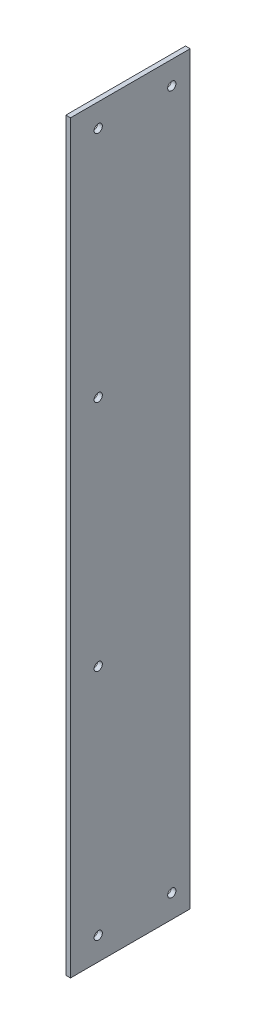
ISO-10303-21;
HEADER;
FILE_DESCRIPTION(('STEP AP214'),'2;1');
FILE_NAME('part.step','',(''),(''),'','','');
FILE_SCHEMA(('AUTOMOTIVE_DESIGN { 1 0 10303 214 1 1 1 1 }'));
ENDSEC;
DATA;
#1=APPLICATION_CONTEXT('core data for automotive mechanical design processes');
#2=APPLICATION_PROTOCOL_DEFINITION('international standard','automotive_design',2000,#1);
#3=PRODUCT_CONTEXT('',#1,'mechanical');
#4=PRODUCT('Part','Part','',(#3));
#5=PRODUCT_RELATED_PRODUCT_CATEGORY('part','',(#4));
#6=PRODUCT_DEFINITION_FORMATION('','',#4);
#7=PRODUCT_DEFINITION_CONTEXT('part definition',#1,'design');
#8=PRODUCT_DEFINITION('design','',#6,#7);
#9=PRODUCT_DEFINITION_SHAPE('','',#8);
#10=(LENGTH_UNIT() NAMED_UNIT(*) SI_UNIT(.MILLI.,.METRE.));
#11=(NAMED_UNIT(*) PLANE_ANGLE_UNIT() SI_UNIT($,.RADIAN.));
#12=(NAMED_UNIT(*) SI_UNIT($,.STERADIAN.) SOLID_ANGLE_UNIT());
#13=UNCERTAINTY_MEASURE_WITH_UNIT(LENGTH_MEASURE(1.E-05),#10,'distance_accuracy_value','');
#14=(GEOMETRIC_REPRESENTATION_CONTEXT(3) GLOBAL_UNCERTAINTY_ASSIGNED_CONTEXT((#13)) GLOBAL_UNIT_ASSIGNED_CONTEXT((#10,
#11,#12)) REPRESENTATION_CONTEXT('',''));
#15=CARTESIAN_POINT('',(0.,0.,0.));
#16=DIRECTION('',(0.,0.,1.));
#17=DIRECTION('',(1.,0.,0.));
#18=AXIS2_PLACEMENT_3D('',#15,#16,#17);
#19=CARTESIAN_POINT('',(3.175,0.,-37.5));
#20=DIRECTION('',(0.,0.,-1.));
#21=DIRECTION('',(0.,1.,0.));
#22=AXIS2_PLACEMENT_3D('',#19,#20,#21);
#23=PLANE('',#22);
#24=DIRECTION('',(0.,-1.,0.));
#25=VECTOR('',#24,1.);
#26=CARTESIAN_POINT('',(0.,0.,-37.5));
#27=LINE('',#26,#25);
#28=CARTESIAN_POINT('',(0.,253.175,-37.5));
#29=VERTEX_POINT('',#28);
#30=CARTESIAN_POINT('',(0.,-253.175,-37.5));
#31=VERTEX_POINT('',#30);
#32=EDGE_CURVE('E51',#29,#31,#27,.T.);
#33=ORIENTED_EDGE('',*,*,#32,.F.);
#34=DIRECTION('',(1.,0.,0.));
#35=VECTOR('',#34,1.);
#36=CARTESIAN_POINT('',(0.,253.175,-37.5));
#37=LINE('',#36,#35);
#38=CARTESIAN_POINT('',(3.175,253.175,-37.5));
#39=VERTEX_POINT('',#38);
#40=EDGE_CURVE('E99',#29,#39,#37,.T.);
#41=ORIENTED_EDGE('',*,*,#40,.T.);
#42=DIRECTION('',(0.,-1.,0.));
#43=VECTOR('',#42,1.);
#44=CARTESIAN_POINT('',(3.175,0.,-37.5));
#45=LINE('',#44,#43);
#46=CARTESIAN_POINT('',(3.175,-253.175,-37.5));
#47=VERTEX_POINT('',#46);
#48=EDGE_CURVE('E11',#39,#47,#45,.T.);
#49=ORIENTED_EDGE('',*,*,#48,.T.);
#50=DIRECTION('',(1.,0.,0.));
#51=VECTOR('',#50,1.);
#52=CARTESIAN_POINT('',(0.,-253.175,-37.5));
#53=LINE('',#52,#51);
#54=EDGE_CURVE('E101',#31,#47,#53,.T.);
#55=ORIENTED_EDGE('',*,*,#54,.F.);
#56=EDGE_LOOP('',(#33,#41,#49,#55));
#57=FACE_BOUND('',#56,.T.);
#58=ADVANCED_FACE('F47',(#57),#23,.T.);
#59=CARTESIAN_POINT('',(3.175,-237.5,25.));
#60=DIRECTION('',(-1.,0.,0.));
#61=DIRECTION('',(0.,0.,1.));
#62=AXIS2_PLACEMENT_3D('',#59,#60,#61);
#63=CYLINDRICAL_SURFACE('',#62,2.80000000000001);
#64=CARTESIAN_POINT('',(3.175,-237.5,25.));
#65=DIRECTION('',(1.,0.,0.));
#66=DIRECTION('',(0.,0.,-1.));
#67=AXIS2_PLACEMENT_3D('',#64,#65,#66);
#68=CIRCLE('',#67,2.80000000000001);
#69=CARTESIAN_POINT('',(3.175,-237.5,22.2));
#70=VERTEX_POINT('',#69);
#71=EDGE_CURVE('E58',#70,#70,#68,.T.);
#72=ORIENTED_EDGE('',*,*,#71,.T.);
#73=EDGE_LOOP('',(#72));
#74=FACE_BOUND('',#73,.T.);
#75=CARTESIAN_POINT('',(0.,-237.5,25.));
#76=DIRECTION('',(1.,0.,0.));
#77=DIRECTION('',(0.,0.,-1.));
#78=AXIS2_PLACEMENT_3D('',#75,#76,#77);
#79=CIRCLE('',#78,2.80000000000001);
#80=CARTESIAN_POINT('',(0.,-237.5,22.2));
#81=VERTEX_POINT('',#80);
#82=EDGE_CURVE('E104',#81,#81,#79,.T.);
#83=ORIENTED_EDGE('',*,*,#82,.F.);
#84=EDGE_LOOP('',(#83));
#85=FACE_BOUND('',#84,.T.);
#86=ADVANCED_FACE('F180',(#74,#85),#63,.F.);
#87=CARTESIAN_POINT('',(3.175,-79.16666667,25.));
#88=DIRECTION('',(-1.,0.,0.));
#89=DIRECTION('',(0.,0.,1.));
#90=AXIS2_PLACEMENT_3D('',#87,#88,#89);
#91=CYLINDRICAL_SURFACE('',#90,2.80000000000001);
#92=CARTESIAN_POINT('',(3.175,-79.16666667,25.));
#93=DIRECTION('',(1.,0.,0.));
#94=DIRECTION('',(0.,0.,-1.));
#95=AXIS2_PLACEMENT_3D('',#92,#93,#94);
#96=CIRCLE('',#95,2.80000000000001);
#97=CARTESIAN_POINT('',(3.175,-79.16666667,22.2));
#98=VERTEX_POINT('',#97);
#99=EDGE_CURVE('E150',#98,#98,#96,.T.);
#100=ORIENTED_EDGE('',*,*,#99,.T.);
#101=EDGE_LOOP('',(#100));
#102=FACE_BOUND('',#101,.T.);
#103=CARTESIAN_POINT('',(0.,-79.16666667,25.));
#104=DIRECTION('',(1.,0.,0.));
#105=DIRECTION('',(0.,0.,-1.));
#106=AXIS2_PLACEMENT_3D('',#103,#104,#105);
#107=CIRCLE('',#106,2.80000000000001);
#108=CARTESIAN_POINT('',(0.,-79.16666667,22.2));
#109=VERTEX_POINT('',#108);
#110=EDGE_CURVE('E172',#109,#109,#107,.T.);
#111=ORIENTED_EDGE('',*,*,#110,.F.);
#112=EDGE_LOOP('',(#111));
#113=FACE_BOUND('',#112,.T.);
#114=ADVANCED_FACE('F182',(#102,#113),#91,.F.);
#115=CARTESIAN_POINT('',(3.175,79.16666666,25.));
#116=DIRECTION('',(-1.,0.,0.));
#117=DIRECTION('',(0.,0.,1.));
#118=AXIS2_PLACEMENT_3D('',#115,#116,#117);
#119=CYLINDRICAL_SURFACE('',#118,2.80000000000001);
#120=CARTESIAN_POINT('',(3.175,79.16666666,25.));
#121=DIRECTION('',(1.,0.,0.));
#122=DIRECTION('',(0.,0.,-1.));
#123=AXIS2_PLACEMENT_3D('',#120,#121,#122);
#124=CIRCLE('',#123,2.80000000000001);
#125=CARTESIAN_POINT('',(3.175,79.16666666,22.2));
#126=VERTEX_POINT('',#125);
#127=EDGE_CURVE('E146',#126,#126,#124,.T.);
#128=ORIENTED_EDGE('',*,*,#127,.T.);
#129=EDGE_LOOP('',(#128));
#130=FACE_BOUND('',#129,.T.);
#131=CARTESIAN_POINT('',(0.,79.16666666,25.));
#132=DIRECTION('',(1.,0.,0.));
#133=DIRECTION('',(0.,0.,-1.));
#134=AXIS2_PLACEMENT_3D('',#131,#132,#133);
#135=CIRCLE('',#134,2.80000000000001);
#136=CARTESIAN_POINT('',(0.,79.16666666,22.2));
#137=VERTEX_POINT('',#136);
#138=EDGE_CURVE('E168',#137,#137,#135,.T.);
#139=ORIENTED_EDGE('',*,*,#138,.F.);
#140=EDGE_LOOP('',(#139));
#141=FACE_BOUND('',#140,.T.);
#142=ADVANCED_FACE('F188',(#130,#141),#119,.F.);
#143=CARTESIAN_POINT('',(3.175,237.49999999,25.));
#144=DIRECTION('',(-1.,0.,0.));
#145=DIRECTION('',(0.,0.,1.));
#146=AXIS2_PLACEMENT_3D('',#143,#144,#145);
#147=CYLINDRICAL_SURFACE('',#146,2.80000000000001);
#148=CARTESIAN_POINT('',(3.175,237.49999999,25.));
#149=DIRECTION('',(1.,0.,0.));
#150=DIRECTION('',(0.,0.,-1.));
#151=AXIS2_PLACEMENT_3D('',#148,#149,#150);
#152=CIRCLE('',#151,2.80000000000001);
#153=CARTESIAN_POINT('',(3.175,237.49999999,22.2));
#154=VERTEX_POINT('',#153);
#155=EDGE_CURVE('E142',#154,#154,#152,.T.);
#156=ORIENTED_EDGE('',*,*,#155,.T.);
#157=EDGE_LOOP('',(#156));
#158=FACE_BOUND('',#157,.T.);
#159=CARTESIAN_POINT('',(0.,237.49999999,25.));
#160=DIRECTION('',(1.,0.,0.));
#161=DIRECTION('',(0.,0.,-1.));
#162=AXIS2_PLACEMENT_3D('',#159,#160,#161);
#163=CIRCLE('',#162,2.80000000000001);
#164=CARTESIAN_POINT('',(0.,237.49999999,22.2));
#165=VERTEX_POINT('',#164);
#166=EDGE_CURVE('E164',#165,#165,#163,.T.);
#167=ORIENTED_EDGE('',*,*,#166,.F.);
#168=EDGE_LOOP('',(#167));
#169=FACE_BOUND('',#168,.T.);
#170=ADVANCED_FACE('F197',(#158,#169),#147,.F.);
#171=CARTESIAN_POINT('',(3.175,237.49999999,-25.));
#172=DIRECTION('',(-1.,0.,0.));
#173=DIRECTION('',(0.,0.,1.));
#174=AXIS2_PLACEMENT_3D('',#171,#172,#173);
#175=CYLINDRICAL_SURFACE('',#174,2.80000000000001);
#176=CARTESIAN_POINT('',(3.175,237.49999999,-25.));
#177=DIRECTION('',(1.,0.,0.));
#178=DIRECTION('',(0.,0.,-1.));
#179=AXIS2_PLACEMENT_3D('',#176,#177,#178);
#180=CIRCLE('',#179,2.80000000000001);
#181=CARTESIAN_POINT('',(3.175,237.49999999,-27.8));
#182=VERTEX_POINT('',#181);
#183=EDGE_CURVE('E138',#182,#182,#180,.T.);
#184=ORIENTED_EDGE('',*,*,#183,.T.);
#185=EDGE_LOOP('',(#184));
#186=FACE_BOUND('',#185,.T.);
#187=CARTESIAN_POINT('',(0.,237.49999999,-25.));
#188=DIRECTION('',(1.,0.,0.));
#189=DIRECTION('',(0.,0.,-1.));
#190=AXIS2_PLACEMENT_3D('',#187,#188,#189);
#191=CIRCLE('',#190,2.80000000000001);
#192=CARTESIAN_POINT('',(0.,237.49999999,-27.8));
#193=VERTEX_POINT('',#192);
#194=EDGE_CURVE('E160',#193,#193,#191,.T.);
#195=ORIENTED_EDGE('',*,*,#194,.F.);
#196=EDGE_LOOP('',(#195));
#197=FACE_BOUND('',#196,.T.);
#198=ADVANCED_FACE('F200',(#186,#197),#175,.F.);
#199=CARTESIAN_POINT('',(3.175,-237.5,-25.));
#200=DIRECTION('',(-1.,0.,0.));
#201=DIRECTION('',(0.,0.,1.));
#202=AXIS2_PLACEMENT_3D('',#199,#200,#201);
#203=CYLINDRICAL_SURFACE('',#202,2.80000000000001);
#204=CARTESIAN_POINT('',(3.175,-237.5,-25.));
#205=DIRECTION('',(1.,0.,0.));
#206=DIRECTION('',(0.,0.,-1.));
#207=AXIS2_PLACEMENT_3D('',#204,#205,#206);
#208=CIRCLE('',#207,2.80000000000001);
#209=CARTESIAN_POINT('',(3.175,-237.5,-27.8));
#210=VERTEX_POINT('',#209);
#211=EDGE_CURVE('E103',#210,#210,#208,.T.);
#212=ORIENTED_EDGE('',*,*,#211,.T.);
#213=EDGE_LOOP('',(#212));
#214=FACE_BOUND('',#213,.T.);
#215=CARTESIAN_POINT('',(0.,-237.5,-25.));
#216=DIRECTION('',(1.,0.,0.));
#217=DIRECTION('',(0.,0.,-1.));
#218=AXIS2_PLACEMENT_3D('',#215,#216,#217);
#219=CIRCLE('',#218,2.80000000000001);
#220=CARTESIAN_POINT('',(0.,-237.5,-27.8));
#221=VERTEX_POINT('',#220);
#222=EDGE_CURVE('E130',#221,#221,#219,.T.);
#223=ORIENTED_EDGE('',*,*,#222,.F.);
#224=EDGE_LOOP('',(#223));
#225=FACE_BOUND('',#224,.T.);
#226=ADVANCED_FACE('F49',(#214,#225),#203,.F.);
#227=CARTESIAN_POINT('',(3.175,0.,0.));
#228=DIRECTION('',(1.,0.,0.));
#229=DIRECTION('',(0.,0.,-1.));
#230=AXIS2_PLACEMENT_3D('',#227,#228,#229);
#231=PLANE('',#230);
#232=ORIENTED_EDGE('',*,*,#211,.F.);
#233=EDGE_LOOP('',(#232));
#234=FACE_BOUND('',#233,.T.);
#235=ORIENTED_EDGE('',*,*,#183,.F.);
#236=EDGE_LOOP('',(#235));
#237=FACE_BOUND('',#236,.T.);
#238=ORIENTED_EDGE('',*,*,#155,.F.);
#239=EDGE_LOOP('',(#238));
#240=FACE_BOUND('',#239,.T.);
#241=ORIENTED_EDGE('',*,*,#127,.F.);
#242=EDGE_LOOP('',(#241));
#243=FACE_BOUND('',#242,.T.);
#244=ORIENTED_EDGE('',*,*,#99,.F.);
#245=EDGE_LOOP('',(#244));
#246=FACE_BOUND('',#245,.T.);
#247=ORIENTED_EDGE('',*,*,#71,.F.);
#248=EDGE_LOOP('',(#247));
#249=FACE_BOUND('',#248,.T.);
#250=ORIENTED_EDGE('',*,*,#48,.F.);
#251=DIRECTION('',(0.,0.,1.));
#252=VECTOR('',#251,1.);
#253=CARTESIAN_POINT('',(3.175,253.175,0.));
#254=LINE('',#253,#252);
#255=CARTESIAN_POINT('',(3.175,253.175,43.85));
#256=VERTEX_POINT('',#255);
#257=EDGE_CURVE('E107',#39,#256,#254,.T.);
#258=ORIENTED_EDGE('',*,*,#257,.T.);
#259=DIRECTION('',(0.,-1.,0.));
#260=VECTOR('',#259,1.);
#261=CARTESIAN_POINT('',(3.175,0.,43.8500000000005));
#262=LINE('',#261,#260);
#263=CARTESIAN_POINT('',(3.175,-253.175,43.85));
#264=VERTEX_POINT('',#263);
#265=EDGE_CURVE('E117',#256,#264,#262,.T.);
#266=ORIENTED_EDGE('',*,*,#265,.T.);
#267=DIRECTION('',(0.,0.,1.));
#268=VECTOR('',#267,1.);
#269=CARTESIAN_POINT('',(3.175,-253.175,0.));
#270=LINE('',#269,#268);
#271=EDGE_CURVE('E120',#47,#264,#270,.T.);
#272=ORIENTED_EDGE('',*,*,#271,.F.);
#273=EDGE_LOOP('',(#250,#258,#266,#272));
#274=FACE_BOUND('',#273,.T.);
#275=ADVANCED_FACE('F207',(#234,#237,#240,#243,#246,#249,#274),#231,.T.);
#276=CARTESIAN_POINT('',(0.,0.,0.));
#277=DIRECTION('',(1.,0.,0.));
#278=DIRECTION('',(0.,0.,-1.));
#279=AXIS2_PLACEMENT_3D('',#276,#277,#278);
#280=PLANE('',#279);
#281=ORIENTED_EDGE('',*,*,#222,.T.);
#282=EDGE_LOOP('',(#281));
#283=FACE_BOUND('',#282,.T.);
#284=ORIENTED_EDGE('',*,*,#194,.T.);
#285=EDGE_LOOP('',(#284));
#286=FACE_BOUND('',#285,.T.);
#287=ORIENTED_EDGE('',*,*,#166,.T.);
#288=EDGE_LOOP('',(#287));
#289=FACE_BOUND('',#288,.T.);
#290=ORIENTED_EDGE('',*,*,#138,.T.);
#291=EDGE_LOOP('',(#290));
#292=FACE_BOUND('',#291,.T.);
#293=ORIENTED_EDGE('',*,*,#110,.T.);
#294=EDGE_LOOP('',(#293));
#295=FACE_BOUND('',#294,.T.);
#296=ORIENTED_EDGE('',*,*,#82,.T.);
#297=EDGE_LOOP('',(#296));
#298=FACE_BOUND('',#297,.T.);
#299=ORIENTED_EDGE('',*,*,#32,.T.);
#300=DIRECTION('',(0.,0.,1.));
#301=VECTOR('',#300,1.);
#302=CARTESIAN_POINT('',(0.,-253.175,0.));
#303=LINE('',#302,#301);
#304=CARTESIAN_POINT('',(0.,-253.175,43.85));
#305=VERTEX_POINT('',#304);
#306=EDGE_CURVE('E67',#31,#305,#303,.T.);
#307=ORIENTED_EDGE('',*,*,#306,.T.);
#308=DIRECTION('',(0.,-1.,0.));
#309=VECTOR('',#308,1.);
#310=CARTESIAN_POINT('',(0.,0.,43.8500000000005));
#311=LINE('',#310,#309);
#312=CARTESIAN_POINT('',(0.,253.175,43.85));
#313=VERTEX_POINT('',#312);
#314=EDGE_CURVE('E111',#313,#305,#311,.T.);
#315=ORIENTED_EDGE('',*,*,#314,.F.);
#316=DIRECTION('',(0.,0.,1.));
#317=VECTOR('',#316,1.);
#318=CARTESIAN_POINT('',(0.,253.175,0.));
#319=LINE('',#318,#317);
#320=EDGE_CURVE('E106',#29,#313,#319,.T.);
#321=ORIENTED_EDGE('',*,*,#320,.F.);
#322=EDGE_LOOP('',(#299,#307,#315,#321));
#323=FACE_BOUND('',#322,.T.);
#324=ADVANCED_FACE('F110',(#283,#286,#289,#292,#295,#298,#323),#280,.F.);
#325=CARTESIAN_POINT('',(0.,-253.175,0.));
#326=DIRECTION('',(0.,1.,0.));
#327=DIRECTION('',(0.,0.,1.));
#328=AXIS2_PLACEMENT_3D('',#325,#326,#327);
#329=PLANE('',#328);
#330=ORIENTED_EDGE('',*,*,#271,.T.);
#331=DIRECTION('',(1.,0.,0.));
#332=VECTOR('',#331,1.);
#333=CARTESIAN_POINT('',(0.,-253.175,43.85));
#334=LINE('',#333,#332);
#335=EDGE_CURVE('E90',#305,#264,#334,.T.);
#336=ORIENTED_EDGE('',*,*,#335,.F.);
#337=ORIENTED_EDGE('',*,*,#306,.F.);
#338=ORIENTED_EDGE('',*,*,#54,.T.);
#339=EDGE_LOOP('',(#330,#336,#337,#338));
#340=FACE_BOUND('',#339,.T.);
#341=ADVANCED_FACE('F215',(#340),#329,.F.);
#342=CARTESIAN_POINT('',(0.,0.,43.8500000000005));
#343=DIRECTION('',(0.,0.,1.));
#344=DIRECTION('',(0.,-1.,0.));
#345=AXIS2_PLACEMENT_3D('',#342,#343,#344);
#346=PLANE('',#345);
#347=ORIENTED_EDGE('',*,*,#265,.F.);
#348=DIRECTION('',(1.,0.,0.));
#349=VECTOR('',#348,1.);
#350=CARTESIAN_POINT('',(0.,253.175,43.85));
#351=LINE('',#350,#349);
#352=EDGE_CURVE('E83',#313,#256,#351,.T.);
#353=ORIENTED_EDGE('',*,*,#352,.F.);
#354=ORIENTED_EDGE('',*,*,#314,.T.);
#355=ORIENTED_EDGE('',*,*,#335,.T.);
#356=EDGE_LOOP('',(#347,#353,#354,#355));
#357=FACE_BOUND('',#356,.T.);
#358=ADVANCED_FACE('F229',(#357),#346,.T.);
#359=CARTESIAN_POINT('',(0.,253.175,0.));
#360=DIRECTION('',(0.,1.,0.));
#361=DIRECTION('',(0.,0.,1.));
#362=AXIS2_PLACEMENT_3D('',#359,#360,#361);
#363=PLANE('',#362);
#364=ORIENTED_EDGE('',*,*,#257,.F.);
#365=ORIENTED_EDGE('',*,*,#40,.F.);
#366=ORIENTED_EDGE('',*,*,#320,.T.);
#367=ORIENTED_EDGE('',*,*,#352,.T.);
#368=EDGE_LOOP('',(#364,#365,#366,#367));
#369=FACE_BOUND('',#368,.T.);
#370=ADVANCED_FACE('F105',(#369),#363,.T.);
#371=CLOSED_SHELL('',(#58,#86,#114,#142,#170,#198,#226,#275,#324,#341,#358,#370));
#372=MANIFOLD_SOLID_BREP('B2',#371);
#373=ADVANCED_BREP_SHAPE_REPRESENTATION('',(#18,#372),#14);
#374=SHAPE_DEFINITION_REPRESENTATION(#9,#373);
ENDSEC;
END-ISO-10303-21;
